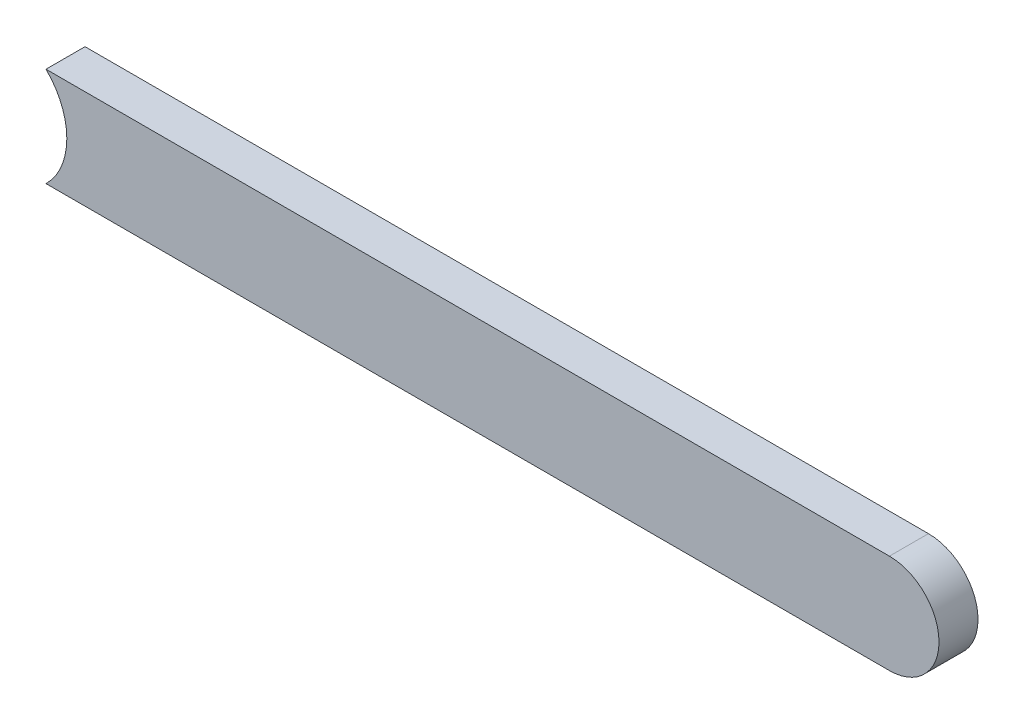
ISO-10303-21;
HEADER;
FILE_DESCRIPTION(('STEP AP214'),'2;1');
FILE_NAME('part.step','',(''),(''),'','','');
FILE_SCHEMA(('AUTOMOTIVE_DESIGN { 1 0 10303 214 1 1 1 1 }'));
ENDSEC;
DATA;
#1=APPLICATION_CONTEXT('core data for automotive mechanical design processes');
#2=APPLICATION_PROTOCOL_DEFINITION('international standard','automotive_design',2000,#1);
#3=PRODUCT_CONTEXT('',#1,'mechanical');
#4=PRODUCT('Part','Part','',(#3));
#5=PRODUCT_RELATED_PRODUCT_CATEGORY('part','',(#4));
#6=PRODUCT_DEFINITION_FORMATION('','',#4);
#7=PRODUCT_DEFINITION_CONTEXT('part definition',#1,'design');
#8=PRODUCT_DEFINITION('design','',#6,#7);
#9=PRODUCT_DEFINITION_SHAPE('','',#8);
#10=(LENGTH_UNIT() NAMED_UNIT(*) SI_UNIT(.MILLI.,.METRE.));
#11=(NAMED_UNIT(*) PLANE_ANGLE_UNIT() SI_UNIT($,.RADIAN.));
#12=(NAMED_UNIT(*) SI_UNIT($,.STERADIAN.) SOLID_ANGLE_UNIT());
#13=UNCERTAINTY_MEASURE_WITH_UNIT(LENGTH_MEASURE(1.E-05),#10,'distance_accuracy_value','');
#14=(GEOMETRIC_REPRESENTATION_CONTEXT(3) GLOBAL_UNCERTAINTY_ASSIGNED_CONTEXT((#13)) GLOBAL_UNIT_ASSIGNED_CONTEXT((#10,
#11,#12)) REPRESENTATION_CONTEXT('',''));
#15=CARTESIAN_POINT('',(0.,0.,0.));
#16=DIRECTION('',(0.,0.,1.));
#17=DIRECTION('',(1.,0.,0.));
#18=AXIS2_PLACEMENT_3D('',#15,#16,#17);
#19=CARTESIAN_POINT('',(147.721268157867,113.3856,0.));
#20=DIRECTION('',(0.,1.,0.));
#21=DIRECTION('',(1.,0.,0.));
#22=AXIS2_PLACEMENT_3D('',#19,#20,#21);
#23=PLANE('',#22);
#24=DIRECTION('',(1.,0.,0.));
#25=VECTOR('',#24,1.);
#26=CARTESIAN_POINT('',(147.4724,113.3856,0.1999996));
#27=LINE('',#26,#25);
#28=CARTESIAN_POINT('',(147.721268157867,113.3856,0.1999996));
#29=VERTEX_POINT('',#28);
#30=CARTESIAN_POINT('',(152.0444,113.3856,0.1999996));
#31=VERTEX_POINT('',#30);
#32=EDGE_CURVE('E11',#29,#31,#27,.T.);
#33=ORIENTED_EDGE('',*,*,#32,.F.);
#34=DIRECTION('',(0.,0.,1.));
#35=VECTOR('',#34,1.);
#36=CARTESIAN_POINT('',(147.721268157867,113.3856,0.));
#37=LINE('',#36,#35);
#38=CARTESIAN_POINT('',(147.721268157867,113.3856,0.));
#39=VERTEX_POINT('',#38);
#40=EDGE_CURVE('E24',#39,#29,#37,.T.);
#41=ORIENTED_EDGE('',*,*,#40,.F.);
#42=DIRECTION('',(1.,0.,0.));
#43=VECTOR('',#42,1.);
#44=CARTESIAN_POINT('',(147.4724,113.3856,0.));
#45=LINE('',#44,#43);
#46=CARTESIAN_POINT('',(152.0444,113.3856,0.));
#47=VERTEX_POINT('',#46);
#48=EDGE_CURVE('E82',#39,#47,#45,.T.);
#49=ORIENTED_EDGE('',*,*,#48,.T.);
#50=DIRECTION('',(0.,0.,1.));
#51=VECTOR('',#50,1.);
#52=CARTESIAN_POINT('',(152.0444,113.3856,0.));
#53=LINE('',#52,#51);
#54=EDGE_CURVE('E37',#47,#31,#53,.T.);
#55=ORIENTED_EDGE('',*,*,#54,.T.);
#56=EDGE_LOOP('',(#33,#41,#49,#55));
#57=FACE_BOUND('',#56,.T.);
#58=ADVANCED_FACE('F17',(#57),#23,.F.);
#59=CARTESIAN_POINT('',(152.0444,113.6396,0.));
#60=DIRECTION('',(0.,0.,-1.));
#61=DIRECTION('',(0.,-1.,0.));
#62=AXIS2_PLACEMENT_3D('',#59,#60,#61);
#63=CYLINDRICAL_SURFACE('',#62,0.254);
#64=CARTESIAN_POINT('',(152.0444,113.6396,0.1999996));
#65=DIRECTION('',(0.,0.,1.));
#66=DIRECTION('',(0.,-1.,0.));
#67=AXIS2_PLACEMENT_3D('',#64,#65,#66);
#68=CIRCLE('',#67,0.254);
#69=CARTESIAN_POINT('',(152.0444,113.8936,0.1999996));
#70=VERTEX_POINT('',#69);
#71=EDGE_CURVE('E97',#31,#70,#68,.T.);
#72=ORIENTED_EDGE('',*,*,#71,.F.);
#73=ORIENTED_EDGE('',*,*,#54,.F.);
#74=CARTESIAN_POINT('',(152.0444,113.6396,0.));
#75=DIRECTION('',(0.,0.,1.));
#76=DIRECTION('',(0.,-1.,0.));
#77=AXIS2_PLACEMENT_3D('',#74,#75,#76);
#78=CIRCLE('',#77,0.254);
#79=CARTESIAN_POINT('',(152.0444,113.8936,0.));
#80=VERTEX_POINT('',#79);
#81=EDGE_CURVE('E94',#47,#80,#78,.T.);
#82=ORIENTED_EDGE('',*,*,#81,.T.);
#83=DIRECTION('',(0.,0.,1.));
#84=VECTOR('',#83,1.);
#85=CARTESIAN_POINT('',(152.0444,113.8936,0.));
#86=LINE('',#85,#84);
#87=EDGE_CURVE('E92',#80,#70,#86,.T.);
#88=ORIENTED_EDGE('',*,*,#87,.T.);
#89=EDGE_LOOP('',(#72,#73,#82,#88));
#90=FACE_BOUND('',#89,.T.);
#91=ADVANCED_FACE('F103',(#90),#63,.T.);
#92=CARTESIAN_POINT('',(152.0444,113.8936,0.));
#93=DIRECTION('',(0.,-1.,0.));
#94=DIRECTION('',(-1.,0.,0.));
#95=AXIS2_PLACEMENT_3D('',#92,#93,#94);
#96=PLANE('',#95);
#97=DIRECTION('',(-1.,0.,0.));
#98=VECTOR('',#97,1.);
#99=CARTESIAN_POINT('',(152.0444,113.8936,0.1999996));
#100=LINE('',#99,#98);
#101=CARTESIAN_POINT('',(147.721268157867,113.8936,0.1999996));
#102=VERTEX_POINT('',#101);
#103=EDGE_CURVE('E89',#70,#102,#100,.T.);
#104=ORIENTED_EDGE('',*,*,#103,.F.);
#105=ORIENTED_EDGE('',*,*,#87,.F.);
#106=DIRECTION('',(-1.,0.,0.));
#107=VECTOR('',#106,1.);
#108=CARTESIAN_POINT('',(152.0444,113.8936,0.));
#109=LINE('',#108,#107);
#110=CARTESIAN_POINT('',(147.721268157867,113.8936,0.));
#111=VERTEX_POINT('',#110);
#112=EDGE_CURVE('E87',#80,#111,#109,.T.);
#113=ORIENTED_EDGE('',*,*,#112,.T.);
#114=DIRECTION('',(0.,0.,1.));
#115=VECTOR('',#114,1.);
#116=CARTESIAN_POINT('',(147.721268157867,113.8936,0.));
#117=LINE('',#116,#115);
#118=EDGE_CURVE('E69',#111,#102,#117,.T.);
#119=ORIENTED_EDGE('',*,*,#118,.T.);
#120=EDGE_LOOP('',(#104,#105,#113,#119));
#121=FACE_BOUND('',#120,.T.);
#122=ADVANCED_FACE('F108',(#121),#96,.F.);
#123=CARTESIAN_POINT('',(147.4724,113.6396,0.));
#124=DIRECTION('',(0.,0.,-1.));
#125=DIRECTION('',(1.,0.,0.));
#126=AXIS2_PLACEMENT_3D('',#123,#124,#125);
#127=CYLINDRICAL_SURFACE('',#126,0.3556);
#128=DIRECTION('',(0.,0.,1.));
#129=VECTOR('',#128,1.);
#130=CARTESIAN_POINT('',(147.828,113.6396,0.));
#131=LINE('',#130,#129);
#132=CARTESIAN_POINT('',(147.828,113.6396,0.));
#133=VERTEX_POINT('',#132);
#134=CARTESIAN_POINT('',(147.828,113.6396,0.1999996));
#135=VERTEX_POINT('',#134);
#136=EDGE_CURVE('E59',#133,#135,#131,.T.);
#137=ORIENTED_EDGE('',*,*,#136,.T.);
#138=CARTESIAN_POINT('',(147.4724,113.6396,0.1999996));
#139=DIRECTION('',(0.,0.,1.));
#140=DIRECTION('',(1.,0.,0.));
#141=AXIS2_PLACEMENT_3D('',#138,#139,#140);
#142=CIRCLE('',#141,0.3556);
#143=EDGE_CURVE('E70',#135,#102,#142,.T.);
#144=ORIENTED_EDGE('',*,*,#143,.T.);
#145=ORIENTED_EDGE('',*,*,#118,.F.);
#146=CARTESIAN_POINT('',(147.4724,113.6396,0.));
#147=DIRECTION('',(0.,0.,1.));
#148=DIRECTION('',(1.,0.,0.));
#149=AXIS2_PLACEMENT_3D('',#146,#147,#148);
#150=CIRCLE('',#149,0.3556);
#151=EDGE_CURVE('E73',#133,#111,#150,.T.);
#152=ORIENTED_EDGE('',*,*,#151,.F.);
#153=EDGE_LOOP('',(#137,#144,#145,#152));
#154=FACE_BOUND('',#153,.T.);
#155=ADVANCED_FACE('F74',(#154),#127,.F.);
#156=CARTESIAN_POINT('',(147.4724,113.6396,0.));
#157=DIRECTION('',(0.,0.,-1.));
#158=DIRECTION('',(1.,0.,0.));
#159=AXIS2_PLACEMENT_3D('',#156,#157,#158);
#160=CYLINDRICAL_SURFACE('',#159,0.3556);
#161=ORIENTED_EDGE('',*,*,#40,.T.);
#162=CARTESIAN_POINT('',(147.4724,113.6396,0.1999996));
#163=DIRECTION('',(0.,0.,1.));
#164=DIRECTION('',(1.,0.,0.));
#165=AXIS2_PLACEMENT_3D('',#162,#163,#164);
#166=CIRCLE('',#165,0.3556);
#167=EDGE_CURVE('E65',#29,#135,#166,.T.);
#168=ORIENTED_EDGE('',*,*,#167,.T.);
#169=ORIENTED_EDGE('',*,*,#136,.F.);
#170=EDGE_CURVE('E63',#39,#133,#150,.T.);
#171=ORIENTED_EDGE('',*,*,#170,.F.);
#172=EDGE_LOOP('',(#161,#168,#169,#171));
#173=FACE_BOUND('',#172,.T.);
#174=ADVANCED_FACE('F61',(#173),#160,.F.);
#175=CARTESIAN_POINT('',(147.4724,113.3856,0.));
#176=DIRECTION('',(0.,0.,-1.));
#177=DIRECTION('',(-1.,0.,0.));
#178=AXIS2_PLACEMENT_3D('',#175,#176,#177);
#179=PLANE('',#178);
#180=ORIENTED_EDGE('',*,*,#48,.F.);
#181=ORIENTED_EDGE('',*,*,#170,.T.);
#182=ORIENTED_EDGE('',*,*,#151,.T.);
#183=ORIENTED_EDGE('',*,*,#112,.F.);
#184=ORIENTED_EDGE('',*,*,#81,.F.);
#185=EDGE_LOOP('',(#180,#181,#182,#183,#184));
#186=FACE_BOUND('',#185,.T.);
#187=ADVANCED_FACE('F80',(#186),#179,.T.);
#188=CARTESIAN_POINT('',(147.4724,113.3856,0.1999996));
#189=DIRECTION('',(0.,0.,-1.));
#190=DIRECTION('',(-1.,0.,0.));
#191=AXIS2_PLACEMENT_3D('',#188,#189,#190);
#192=PLANE('',#191);
#193=ORIENTED_EDGE('',*,*,#167,.F.);
#194=ORIENTED_EDGE('',*,*,#32,.T.);
#195=ORIENTED_EDGE('',*,*,#71,.T.);
#196=ORIENTED_EDGE('',*,*,#103,.T.);
#197=ORIENTED_EDGE('',*,*,#143,.F.);
#198=EDGE_LOOP('',(#193,#194,#195,#196,#197));
#199=FACE_BOUND('',#198,.T.);
#200=ADVANCED_FACE('F106',(#199),#192,.F.);
#201=CLOSED_SHELL('',(#58,#91,#122,#155,#174,#187,#200));
#202=MANIFOLD_SOLID_BREP('B1',#201);
#203=ADVANCED_BREP_SHAPE_REPRESENTATION('',(#18,#202),#14);
#204=SHAPE_DEFINITION_REPRESENTATION(#9,#203);
ENDSEC;
END-ISO-10303-21;
